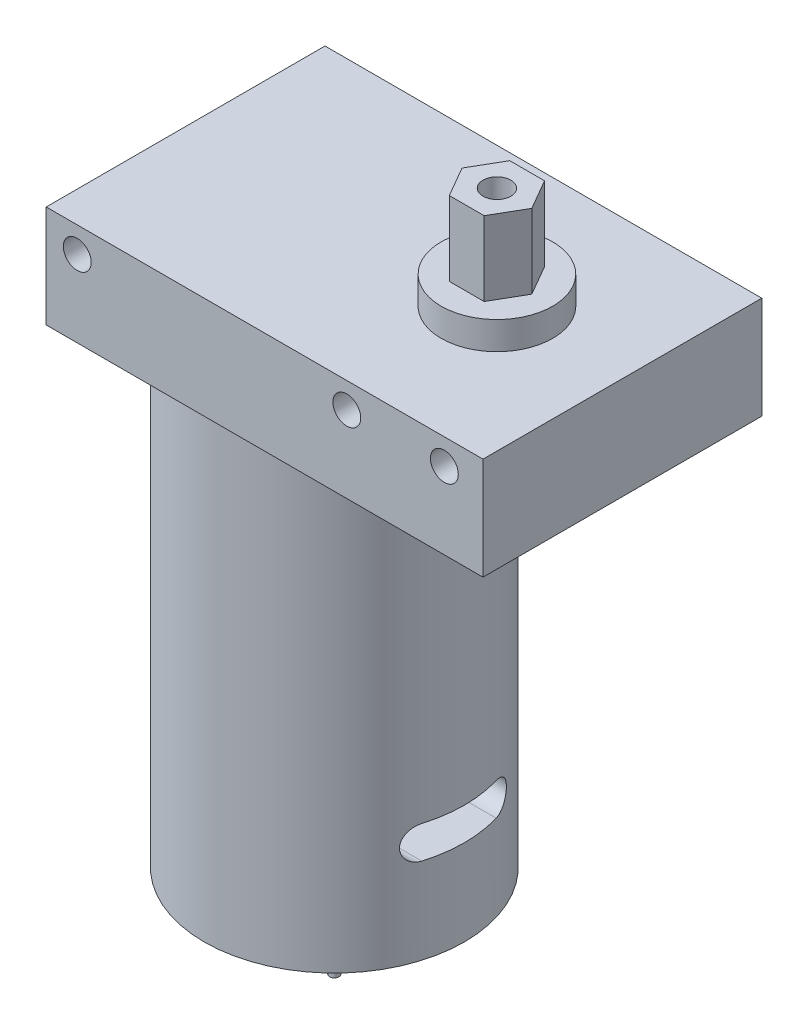
ISO-10303-21;
HEADER;
FILE_DESCRIPTION(('STEP AP214'),'2;1');
FILE_NAME('part.step','',(''),(''),'','','');
FILE_SCHEMA(('AUTOMOTIVE_DESIGN { 1 0 10303 214 1 1 1 1 }'));
ENDSEC;
DATA;
#1=APPLICATION_CONTEXT('core data for automotive mechanical design processes');
#2=APPLICATION_PROTOCOL_DEFINITION('international standard','automotive_design',2000,#1);
#3=PRODUCT_CONTEXT('',#1,'mechanical');
#4=PRODUCT('Part','Part','',(#3));
#5=PRODUCT_RELATED_PRODUCT_CATEGORY('part','',(#4));
#6=PRODUCT_DEFINITION_FORMATION('','',#4);
#7=PRODUCT_DEFINITION_CONTEXT('part definition',#1,'design');
#8=PRODUCT_DEFINITION('design','',#6,#7);
#9=PRODUCT_DEFINITION_SHAPE('','',#8);
#10=(LENGTH_UNIT() NAMED_UNIT(*) SI_UNIT(.MILLI.,.METRE.));
#11=(NAMED_UNIT(*) PLANE_ANGLE_UNIT() SI_UNIT($,.RADIAN.));
#12=(NAMED_UNIT(*) SI_UNIT($,.STERADIAN.) SOLID_ANGLE_UNIT());
#13=UNCERTAINTY_MEASURE_WITH_UNIT(LENGTH_MEASURE(1.E-05),#10,'distance_accuracy_value','');
#14=(GEOMETRIC_REPRESENTATION_CONTEXT(3) GLOBAL_UNCERTAINTY_ASSIGNED_CONTEXT((#13)) GLOBAL_UNIT_ASSIGNED_CONTEXT((#10,
#11,#12)) REPRESENTATION_CONTEXT('',''));
#15=CARTESIAN_POINT('',(0.,0.,0.));
#16=DIRECTION('',(0.,0.,1.));
#17=DIRECTION('',(1.,0.,0.));
#18=AXIS2_PLACEMENT_3D('',#15,#16,#17);
#19=CARTESIAN_POINT('',(16.,-52.,15.));
#20=DIRECTION('',(0.,-1.,0.));
#21=DIRECTION('',(0.,0.,-1.));
#22=AXIS2_PLACEMENT_3D('',#19,#20,#21);
#23=PLANE('',#22);
#24=CARTESIAN_POINT('',(16.,-52.,15.));
#25=DIRECTION('',(0.,-1.,0.));
#26=DIRECTION('',(0.,0.,-1.));
#27=AXIS2_PLACEMENT_3D('',#24,#25,#26);
#28=CIRCLE('',#27,5.);
#29=CARTESIAN_POINT('',(16.,-52.,10.));
#30=VERTEX_POINT('',#29);
#31=EDGE_CURVE('E252',#30,#30,#28,.T.);
#32=ORIENTED_EDGE('',*,*,#31,.T.);
#33=EDGE_LOOP('',(#32));
#34=FACE_BOUND('',#33,.T.);
#35=CARTESIAN_POINT('',(16.,-52.,15.));
#36=DIRECTION('',(0.,-1.,0.));
#37=DIRECTION('',(0.,0.,-1.));
#38=AXIS2_PLACEMENT_3D('',#35,#36,#37);
#39=CIRCLE('',#38,0.499999999999999);
#40=CARTESIAN_POINT('',(16.,-52.,14.5));
#41=VERTEX_POINT('',#40);
#42=EDGE_CURVE('E497',#41,#41,#39,.T.);
#43=ORIENTED_EDGE('',*,*,#42,.F.);
#44=EDGE_LOOP('',(#43));
#45=FACE_BOUND('',#44,.T.);
#46=ADVANCED_FACE('F42',(#34,#45),#23,.T.);
#47=CARTESIAN_POINT('',(16.,-50.,15.));
#48=DIRECTION('',(0.,-1.,0.));
#49=DIRECTION('',(0.,0.,-1.));
#50=AXIS2_PLACEMENT_3D('',#47,#48,#49);
#51=PLANE('',#50);
#52=CARTESIAN_POINT('',(16.,-50.,15.));
#53=DIRECTION('',(0.,-1.,0.));
#54=DIRECTION('',(0.,0.,-1.));
#55=AXIS2_PLACEMENT_3D('',#52,#53,#54);
#56=CIRCLE('',#55,14.);
#57=CARTESIAN_POINT('',(16.,-50.,0.999999999999999));
#58=VERTEX_POINT('',#57);
#59=EDGE_CURVE('E246',#58,#58,#56,.T.);
#60=ORIENTED_EDGE('',*,*,#59,.T.);
#61=EDGE_LOOP('',(#60));
#62=FACE_BOUND('',#61,.T.);
#63=CARTESIAN_POINT('',(16.,-50.,15.));
#64=DIRECTION('',(0.,-1.,0.));
#65=DIRECTION('',(0.,0.,-1.));
#66=AXIS2_PLACEMENT_3D('',#63,#64,#65);
#67=CIRCLE('',#66,5.);
#68=CARTESIAN_POINT('',(16.,-50.,10.));
#69=VERTEX_POINT('',#68);
#70=EDGE_CURVE('E249',#69,#69,#67,.T.);
#71=ORIENTED_EDGE('',*,*,#70,.F.);
#72=EDGE_LOOP('',(#71));
#73=FACE_BOUND('',#72,.T.);
#74=ADVANCED_FACE('F230',(#62,#73),#51,.T.);
#75=CARTESIAN_POINT('',(0.,0.,0.));
#76=DIRECTION('',(0.,1.,0.));
#77=DIRECTION('',(0.,0.,1.));
#78=AXIS2_PLACEMENT_3D('',#75,#76,#77);
#79=PLANE('',#78);
#80=DIRECTION('',(0.,0.,1.));
#81=VECTOR('',#80,1.);
#82=CARTESIAN_POINT('',(0.,0.,0.));
#83=LINE('',#82,#81);
#84=CARTESIAN_POINT('',(0.,0.,0.));
#85=VERTEX_POINT('',#84);
#86=CARTESIAN_POINT('',(0.,0.,30.));
#87=VERTEX_POINT('',#86);
#88=EDGE_CURVE('E332',#85,#87,#83,.T.);
#89=ORIENTED_EDGE('',*,*,#88,.F.);
#90=DIRECTION('',(-1.,0.,0.));
#91=VECTOR('',#90,1.);
#92=CARTESIAN_POINT('',(0.,0.,0.));
#93=LINE('',#92,#91);
#94=CARTESIAN_POINT('',(47.,0.,0.));
#95=VERTEX_POINT('',#94);
#96=EDGE_CURVE('E341',#95,#85,#93,.T.);
#97=ORIENTED_EDGE('',*,*,#96,.F.);
#98=DIRECTION('',(0.,0.,-1.));
#99=VECTOR('',#98,1.);
#100=CARTESIAN_POINT('',(47.,0.,0.));
#101=LINE('',#100,#99);
#102=CARTESIAN_POINT('',(47.,0.,30.));
#103=VERTEX_POINT('',#102);
#104=EDGE_CURVE('E357',#103,#95,#101,.T.);
#105=ORIENTED_EDGE('',*,*,#104,.F.);
#106=DIRECTION('',(1.,0.,0.));
#107=VECTOR('',#106,1.);
#108=CARTESIAN_POINT('',(0.,0.,30.));
#109=LINE('',#108,#107);
#110=EDGE_CURVE('E354',#87,#103,#109,.T.);
#111=ORIENTED_EDGE('',*,*,#110,.F.);
#112=EDGE_LOOP('',(#89,#97,#105,#111));
#113=FACE_BOUND('',#112,.T.);
#114=CARTESIAN_POINT('',(16.,0.,15.));
#115=DIRECTION('',(0.,1.,0.));
#116=DIRECTION('',(0.,0.,1.));
#117=AXIS2_PLACEMENT_3D('',#114,#115,#116);
#118=CIRCLE('',#117,14.);
#119=CARTESIAN_POINT('',(16.,0.,29.));
#120=VERTEX_POINT('',#119);
#121=EDGE_CURVE('E184',#120,#120,#118,.F.);
#122=ORIENTED_EDGE('',*,*,#121,.F.);
#123=EDGE_LOOP('',(#122));
#124=FACE_BOUND('',#123,.T.);
#125=ADVANCED_FACE('F235',(#113,#124),#79,.F.);
#126=CARTESIAN_POINT('',(33.5,14.,15.));
#127=DIRECTION('',(0.,1.,0.));
#128=DIRECTION('',(0.,0.,1.));
#129=AXIS2_PLACEMENT_3D('',#126,#127,#128);
#130=PLANE('',#129);
#131=CARTESIAN_POINT('',(33.5,14.,15.));
#132=DIRECTION('',(0.,1.,0.));
#133=DIRECTION('',(0.,0.,1.));
#134=AXIS2_PLACEMENT_3D('',#131,#132,#133);
#135=CIRCLE('',#134,5.99999999999999);
#136=CARTESIAN_POINT('',(33.5,14.,21.));
#137=VERTEX_POINT('',#136);
#138=EDGE_CURVE('E328',#137,#137,#135,.T.);
#139=ORIENTED_EDGE('',*,*,#138,.T.);
#140=EDGE_LOOP('',(#139));
#141=FACE_BOUND('',#140,.T.);
#142=DIRECTION('',(-0.5,0.,-0.866025403784438));
#143=VECTOR('',#142,1.);
#144=CARTESIAN_POINT('',(37.2527767497326,14.,15.));
#145=LINE('',#144,#143);
#146=CARTESIAN_POINT('',(37.2527767497326,14.,15.));
#147=VERTEX_POINT('',#146);
#148=CARTESIAN_POINT('',(35.3763883748663,14.,11.75));
#149=VERTEX_POINT('',#148);
#150=EDGE_CURVE('E291',#147,#149,#145,.T.);
#151=ORIENTED_EDGE('',*,*,#150,.F.);
#152=DIRECTION('',(0.5,0.,-0.866025403784439));
#153=VECTOR('',#152,1.);
#154=CARTESIAN_POINT('',(35.3763883748663,14.,18.25));
#155=LINE('',#154,#153);
#156=CARTESIAN_POINT('',(35.3763883748663,14.,18.25));
#157=VERTEX_POINT('',#156);
#158=EDGE_CURVE('E266',#157,#147,#155,.T.);
#159=ORIENTED_EDGE('',*,*,#158,.F.);
#160=DIRECTION('',(1.,0.,0.));
#161=VECTOR('',#160,1.);
#162=CARTESIAN_POINT('',(31.6236116251337,14.,18.25));
#163=LINE('',#162,#161);
#164=CARTESIAN_POINT('',(31.6236116251337,14.,18.25));
#165=VERTEX_POINT('',#164);
#166=EDGE_CURVE('E272',#165,#157,#163,.T.);
#167=ORIENTED_EDGE('',*,*,#166,.F.);
#168=DIRECTION('',(0.5,0.,0.866025403784438));
#169=VECTOR('',#168,1.);
#170=CARTESIAN_POINT('',(29.7472232502674,14.,15.));
#171=LINE('',#170,#169);
#172=CARTESIAN_POINT('',(29.7472232502674,14.,15.));
#173=VERTEX_POINT('',#172);
#174=EDGE_CURVE('E300',#173,#165,#171,.T.);
#175=ORIENTED_EDGE('',*,*,#174,.F.);
#176=DIRECTION('',(-0.5,0.,0.866025403784439));
#177=VECTOR('',#176,1.);
#178=CARTESIAN_POINT('',(31.6236116251337,14.,11.75));
#179=LINE('',#178,#177);
#180=CARTESIAN_POINT('',(31.6236116251337,14.,11.75));
#181=VERTEX_POINT('',#180);
#182=EDGE_CURVE('E297',#181,#173,#179,.T.);
#183=ORIENTED_EDGE('',*,*,#182,.F.);
#184=DIRECTION('',(-1.,0.,0.));
#185=VECTOR('',#184,1.);
#186=CARTESIAN_POINT('',(35.3763883748663,14.,11.75));
#187=LINE('',#186,#185);
#188=EDGE_CURVE('E294',#149,#181,#187,.T.);
#189=ORIENTED_EDGE('',*,*,#188,.F.);
#190=EDGE_LOOP('',(#151,#159,#167,#175,#183,#189));
#191=FACE_BOUND('',#190,.T.);
#192=ADVANCED_FACE('F240',(#141,#191),#130,.T.);
#193=CARTESIAN_POINT('',(0.,11.,0.));
#194=DIRECTION('',(0.,1.,0.));
#195=DIRECTION('',(0.,0.,1.));
#196=AXIS2_PLACEMENT_3D('',#193,#194,#195);
#197=PLANE('',#196);
#198=DIRECTION('',(0.,0.,1.));
#199=VECTOR('',#198,1.);
#200=CARTESIAN_POINT('',(0.,11.,0.));
#201=LINE('',#200,#199);
#202=CARTESIAN_POINT('',(0.,11.,0.));
#203=VERTEX_POINT('',#202);
#204=CARTESIAN_POINT('',(0.,11.,30.));
#205=VERTEX_POINT('',#204);
#206=EDGE_CURVE('E336',#203,#205,#201,.T.);
#207=ORIENTED_EDGE('',*,*,#206,.T.);
#208=DIRECTION('',(1.,0.,0.));
#209=VECTOR('',#208,1.);
#210=CARTESIAN_POINT('',(0.,11.,30.));
#211=LINE('',#210,#209);
#212=CARTESIAN_POINT('',(47.,11.,30.));
#213=VERTEX_POINT('',#212);
#214=EDGE_CURVE('E340',#205,#213,#211,.T.);
#215=ORIENTED_EDGE('',*,*,#214,.T.);
#216=DIRECTION('',(0.,0.,-1.));
#217=VECTOR('',#216,1.);
#218=CARTESIAN_POINT('',(47.,11.,0.));
#219=LINE('',#218,#217);
#220=CARTESIAN_POINT('',(47.,11.,0.));
#221=VERTEX_POINT('',#220);
#222=EDGE_CURVE('E344',#213,#221,#219,.T.);
#223=ORIENTED_EDGE('',*,*,#222,.T.);
#224=DIRECTION('',(-1.,0.,0.));
#225=VECTOR('',#224,1.);
#226=CARTESIAN_POINT('',(0.,11.,0.));
#227=LINE('',#226,#225);
#228=EDGE_CURVE('E347',#221,#203,#227,.T.);
#229=ORIENTED_EDGE('',*,*,#228,.T.);
#230=EDGE_LOOP('',(#207,#215,#223,#229));
#231=FACE_BOUND('',#230,.T.);
#232=CARTESIAN_POINT('',(33.5,11.,15.));
#233=DIRECTION('',(0.,1.,0.));
#234=DIRECTION('',(0.,0.,1.));
#235=AXIS2_PLACEMENT_3D('',#232,#233,#234);
#236=CIRCLE('',#235,5.99999999999999);
#237=CARTESIAN_POINT('',(33.5,11.,21.));
#238=VERTEX_POINT('',#237);
#239=EDGE_CURVE('E327',#238,#238,#236,.T.);
#240=ORIENTED_EDGE('',*,*,#239,.F.);
#241=EDGE_LOOP('',(#240));
#242=FACE_BOUND('',#241,.T.);
#243=ADVANCED_FACE('F419',(#231,#242),#197,.T.);
#244=CARTESIAN_POINT('',(0.,11.,0.));
#245=DIRECTION('',(1.,0.,0.));
#246=DIRECTION('',(0.,0.,-1.));
#247=AXIS2_PLACEMENT_3D('',#244,#245,#246);
#248=PLANE('',#247);
#249=ORIENTED_EDGE('',*,*,#88,.T.);
#250=DIRECTION('',(0.,-1.,0.));
#251=VECTOR('',#250,1.);
#252=CARTESIAN_POINT('',(0.,11.,30.));
#253=LINE('',#252,#251);
#254=EDGE_CURVE('E373',#205,#87,#253,.T.);
#255=ORIENTED_EDGE('',*,*,#254,.F.);
#256=ORIENTED_EDGE('',*,*,#206,.F.);
#257=DIRECTION('',(0.,-1.,0.));
#258=VECTOR('',#257,1.);
#259=CARTESIAN_POINT('',(0.,11.,0.));
#260=LINE('',#259,#258);
#261=EDGE_CURVE('E350',#203,#85,#260,.T.);
#262=ORIENTED_EDGE('',*,*,#261,.T.);
#263=EDGE_LOOP('',(#249,#255,#256,#262));
#264=FACE_BOUND('',#263,.T.);
#265=ADVANCED_FACE('F44',(#264),#248,.F.);
#266=CARTESIAN_POINT('',(0.,11.,30.));
#267=DIRECTION('',(0.,0.,-1.));
#268=DIRECTION('',(-1.,0.,0.));
#269=AXIS2_PLACEMENT_3D('',#266,#267,#268);
#270=PLANE('',#269);
#271=CARTESIAN_POINT('',(42.8407573826274,8.25,30.));
#272=DIRECTION('',(0.,0.,1.));
#273=DIRECTION('',(1.,0.,0.));
#274=AXIS2_PLACEMENT_3D('',#271,#272,#273);
#275=CIRCLE('',#274,1.5);
#276=CARTESIAN_POINT('',(44.3407573826274,8.25,30.));
#277=VERTEX_POINT('',#276);
#278=EDGE_CURVE('E444',#277,#277,#275,.T.);
#279=ORIENTED_EDGE('',*,*,#278,.F.);
#280=EDGE_LOOP('',(#279));
#281=FACE_BOUND('',#280,.T.);
#282=CARTESIAN_POINT('',(32.3407573826274,8.25,30.));
#283=DIRECTION('',(0.,0.,1.));
#284=DIRECTION('',(1.,0.,0.));
#285=AXIS2_PLACEMENT_3D('',#282,#283,#284);
#286=CIRCLE('',#285,1.5);
#287=CARTESIAN_POINT('',(33.8407573826274,8.25,30.));
#288=VERTEX_POINT('',#287);
#289=EDGE_CURVE('E448',#288,#288,#286,.T.);
#290=ORIENTED_EDGE('',*,*,#289,.F.);
#291=EDGE_LOOP('',(#290));
#292=FACE_BOUND('',#291,.T.);
#293=CARTESIAN_POINT('',(3.34075738262738,8.25,30.));
#294=DIRECTION('',(0.,0.,1.));
#295=DIRECTION('',(1.,0.,0.));
#296=AXIS2_PLACEMENT_3D('',#293,#294,#295);
#297=CIRCLE('',#296,1.5);
#298=CARTESIAN_POINT('',(4.84075738262738,8.25,30.));
#299=VERTEX_POINT('',#298);
#300=EDGE_CURVE('E260',#299,#299,#297,.T.);
#301=ORIENTED_EDGE('',*,*,#300,.F.);
#302=EDGE_LOOP('',(#301));
#303=FACE_BOUND('',#302,.T.);
#304=ORIENTED_EDGE('',*,*,#110,.T.);
#305=DIRECTION('',(0.,-1.,0.));
#306=VECTOR('',#305,1.);
#307=CARTESIAN_POINT('',(47.,11.,30.));
#308=LINE('',#307,#306);
#309=EDGE_CURVE('E369',#213,#103,#308,.T.);
#310=ORIENTED_EDGE('',*,*,#309,.F.);
#311=ORIENTED_EDGE('',*,*,#214,.F.);
#312=ORIENTED_EDGE('',*,*,#254,.T.);
#313=EDGE_LOOP('',(#304,#310,#311,#312));
#314=FACE_BOUND('',#313,.T.);
#315=ADVANCED_FACE('F433',(#281,#292,#303,#314),#270,.F.);
#316=CARTESIAN_POINT('',(47.,11.,0.));
#317=DIRECTION('',(-1.,0.,0.));
#318=DIRECTION('',(0.,0.,1.));
#319=AXIS2_PLACEMENT_3D('',#316,#317,#318);
#320=PLANE('',#319);
#321=ORIENTED_EDGE('',*,*,#104,.T.);
#322=DIRECTION('',(0.,-1.,0.));
#323=VECTOR('',#322,1.);
#324=CARTESIAN_POINT('',(47.,11.,0.));
#325=LINE('',#324,#323);
#326=EDGE_CURVE('E365',#221,#95,#325,.T.);
#327=ORIENTED_EDGE('',*,*,#326,.F.);
#328=ORIENTED_EDGE('',*,*,#222,.F.);
#329=ORIENTED_EDGE('',*,*,#309,.T.);
#330=EDGE_LOOP('',(#321,#327,#328,#329));
#331=FACE_BOUND('',#330,.T.);
#332=ADVANCED_FACE('F430',(#331),#320,.F.);
#333=CARTESIAN_POINT('',(0.,11.,0.));
#334=DIRECTION('',(0.,0.,1.));
#335=DIRECTION('',(1.,0.,0.));
#336=AXIS2_PLACEMENT_3D('',#333,#334,#335);
#337=PLANE('',#336);
#338=CARTESIAN_POINT('',(42.8407573826274,8.25,0.));
#339=DIRECTION('',(0.,0.,1.));
#340=DIRECTION('',(1.,0.,0.));
#341=AXIS2_PLACEMENT_3D('',#338,#339,#340);
#342=CIRCLE('',#341,1.5);
#343=CARTESIAN_POINT('',(44.3407573826274,8.25,0.));
#344=VERTEX_POINT('',#343);
#345=EDGE_CURVE('E474',#344,#344,#342,.T.);
#346=ORIENTED_EDGE('',*,*,#345,.T.);
#347=EDGE_LOOP('',(#346));
#348=FACE_BOUND('',#347,.T.);
#349=CARTESIAN_POINT('',(32.3407573826274,8.25,0.));
#350=DIRECTION('',(0.,0.,1.));
#351=DIRECTION('',(1.,0.,0.));
#352=AXIS2_PLACEMENT_3D('',#349,#350,#351);
#353=CIRCLE('',#352,1.5);
#354=CARTESIAN_POINT('',(33.8407573826274,8.25,0.));
#355=VERTEX_POINT('',#354);
#356=EDGE_CURVE('E468',#355,#355,#353,.T.);
#357=ORIENTED_EDGE('',*,*,#356,.T.);
#358=EDGE_LOOP('',(#357));
#359=FACE_BOUND('',#358,.T.);
#360=CARTESIAN_POINT('',(3.34075738262738,8.25,0.));
#361=DIRECTION('',(0.,0.,1.));
#362=DIRECTION('',(1.,0.,0.));
#363=AXIS2_PLACEMENT_3D('',#360,#361,#362);
#364=CIRCLE('',#363,1.5);
#365=CARTESIAN_POINT('',(4.84075738262738,8.25,0.));
#366=VERTEX_POINT('',#365);
#367=EDGE_CURVE('E253',#366,#366,#364,.T.);
#368=ORIENTED_EDGE('',*,*,#367,.T.);
#369=EDGE_LOOP('',(#368));
#370=FACE_BOUND('',#369,.T.);
#371=ORIENTED_EDGE('',*,*,#96,.T.);
#372=ORIENTED_EDGE('',*,*,#261,.F.);
#373=ORIENTED_EDGE('',*,*,#228,.F.);
#374=ORIENTED_EDGE('',*,*,#326,.T.);
#375=EDGE_LOOP('',(#371,#372,#373,#374));
#376=FACE_BOUND('',#375,.T.);
#377=ADVANCED_FACE('F423',(#348,#359,#370,#376),#337,.F.);
#378=CARTESIAN_POINT('',(33.5,14.,15.));
#379=DIRECTION('',(0.,-1.,0.));
#380=DIRECTION('',(0.,0.,-1.));
#381=AXIS2_PLACEMENT_3D('',#378,#379,#380);
#382=CYLINDRICAL_SURFACE('',#381,5.99999999999999);
#383=ORIENTED_EDGE('',*,*,#138,.F.);
#384=EDGE_LOOP('',(#383));
#385=FACE_BOUND('',#384,.T.);
#386=ORIENTED_EDGE('',*,*,#239,.T.);
#387=EDGE_LOOP('',(#386));
#388=FACE_BOUND('',#387,.T.);
#389=ADVANCED_FACE('F415',(#385,#388),#382,.T.);
#390=CARTESIAN_POINT('',(35.3763883748663,22.,18.25));
#391=DIRECTION('',(-0.866025403784439,0.,-0.5));
#392=DIRECTION('',(-0.5,0.,0.866025403784439));
#393=AXIS2_PLACEMENT_3D('',#390,#391,#392);
#394=PLANE('',#393);
#395=ORIENTED_EDGE('',*,*,#158,.T.);
#396=DIRECTION('',(0.,-1.,0.));
#397=VECTOR('',#396,1.);
#398=CARTESIAN_POINT('',(37.2527767497326,22.,15.));
#399=LINE('',#398,#397);
#400=CARTESIAN_POINT('',(37.2527767497326,22.,15.));
#401=VERTEX_POINT('',#400);
#402=EDGE_CURVE('E324',#401,#147,#399,.T.);
#403=ORIENTED_EDGE('',*,*,#402,.F.);
#404=DIRECTION('',(0.5,0.,-0.866025403784439));
#405=VECTOR('',#404,1.);
#406=CARTESIAN_POINT('',(35.3763883748663,22.,18.25));
#407=LINE('',#406,#405);
#408=CARTESIAN_POINT('',(35.3763883748663,22.,18.25));
#409=VERTEX_POINT('',#408);
#410=EDGE_CURVE('E267',#409,#401,#407,.T.);
#411=ORIENTED_EDGE('',*,*,#410,.F.);
#412=DIRECTION('',(0.,-1.,0.));
#413=VECTOR('',#412,1.);
#414=CARTESIAN_POINT('',(35.3763883748663,22.,18.25));
#415=LINE('',#414,#413);
#416=EDGE_CURVE('E287',#409,#157,#415,.T.);
#417=ORIENTED_EDGE('',*,*,#416,.T.);
#418=EDGE_LOOP('',(#395,#403,#411,#417));
#419=FACE_BOUND('',#418,.T.);
#420=ADVANCED_FACE('F411',(#419),#394,.F.);
#421=CARTESIAN_POINT('',(37.2527767497326,22.,15.));
#422=DIRECTION('',(-0.866025403784438,0.,0.5));
#423=DIRECTION('',(0.5,0.,0.866025403784439));
#424=AXIS2_PLACEMENT_3D('',#421,#422,#423);
#425=PLANE('',#424);
#426=ORIENTED_EDGE('',*,*,#150,.T.);
#427=DIRECTION('',(0.,-1.,0.));
#428=VECTOR('',#427,1.);
#429=CARTESIAN_POINT('',(35.3763883748663,22.,11.75));
#430=LINE('',#429,#428);
#431=CARTESIAN_POINT('',(35.3763883748663,22.,11.75));
#432=VERTEX_POINT('',#431);
#433=EDGE_CURVE('E320',#432,#149,#430,.T.);
#434=ORIENTED_EDGE('',*,*,#433,.F.);
#435=DIRECTION('',(-0.5,0.,-0.866025403784438));
#436=VECTOR('',#435,1.);
#437=CARTESIAN_POINT('',(37.2527767497326,22.,15.));
#438=LINE('',#437,#436);
#439=EDGE_CURVE('E271',#401,#432,#438,.T.);
#440=ORIENTED_EDGE('',*,*,#439,.F.);
#441=ORIENTED_EDGE('',*,*,#402,.T.);
#442=EDGE_LOOP('',(#426,#434,#440,#441));
#443=FACE_BOUND('',#442,.T.);
#444=ADVANCED_FACE('F407',(#443),#425,.F.);
#445=CARTESIAN_POINT('',(35.3763883748663,22.,11.75));
#446=DIRECTION('',(0.,0.,1.));
#447=DIRECTION('',(1.,0.,0.));
#448=AXIS2_PLACEMENT_3D('',#445,#446,#447);
#449=PLANE('',#448);
#450=ORIENTED_EDGE('',*,*,#188,.T.);
#451=DIRECTION('',(0.,-1.,0.));
#452=VECTOR('',#451,1.);
#453=CARTESIAN_POINT('',(31.6236116251337,22.,11.75));
#454=LINE('',#453,#452);
#455=CARTESIAN_POINT('',(31.6236116251337,22.,11.75));
#456=VERTEX_POINT('',#455);
#457=EDGE_CURVE('E316',#456,#181,#454,.T.);
#458=ORIENTED_EDGE('',*,*,#457,.F.);
#459=DIRECTION('',(-1.,0.,0.));
#460=VECTOR('',#459,1.);
#461=CARTESIAN_POINT('',(35.3763883748663,22.,11.75));
#462=LINE('',#461,#460);
#463=EDGE_CURVE('E275',#432,#456,#462,.T.);
#464=ORIENTED_EDGE('',*,*,#463,.F.);
#465=ORIENTED_EDGE('',*,*,#433,.T.);
#466=EDGE_LOOP('',(#450,#458,#464,#465));
#467=FACE_BOUND('',#466,.T.);
#468=ADVANCED_FACE('F403',(#467),#449,.F.);
#469=CARTESIAN_POINT('',(31.6236116251337,22.,11.75));
#470=DIRECTION('',(0.866025403784439,0.,0.5));
#471=DIRECTION('',(0.5,0.,-0.866025403784439));
#472=AXIS2_PLACEMENT_3D('',#469,#470,#471);
#473=PLANE('',#472);
#474=ORIENTED_EDGE('',*,*,#182,.T.);
#475=DIRECTION('',(0.,-1.,0.));
#476=VECTOR('',#475,1.);
#477=CARTESIAN_POINT('',(29.7472232502674,22.,15.));
#478=LINE('',#477,#476);
#479=CARTESIAN_POINT('',(29.7472232502674,22.,15.));
#480=VERTEX_POINT('',#479);
#481=EDGE_CURVE('E312',#480,#173,#478,.T.);
#482=ORIENTED_EDGE('',*,*,#481,.F.);
#483=DIRECTION('',(-0.5,0.,0.866025403784439));
#484=VECTOR('',#483,1.);
#485=CARTESIAN_POINT('',(31.6236116251337,22.,11.75));
#486=LINE('',#485,#484);
#487=EDGE_CURVE('E278',#456,#480,#486,.T.);
#488=ORIENTED_EDGE('',*,*,#487,.F.);
#489=ORIENTED_EDGE('',*,*,#457,.T.);
#490=EDGE_LOOP('',(#474,#482,#488,#489));
#491=FACE_BOUND('',#490,.T.);
#492=ADVANCED_FACE('F399',(#491),#473,.F.);
#493=CARTESIAN_POINT('',(29.7472232502674,22.,15.));
#494=DIRECTION('',(0.866025403784438,0.,-0.5));
#495=DIRECTION('',(-0.5,0.,-0.866025403784439));
#496=AXIS2_PLACEMENT_3D('',#493,#494,#495);
#497=PLANE('',#496);
#498=ORIENTED_EDGE('',*,*,#174,.T.);
#499=DIRECTION('',(0.,-1.,0.));
#500=VECTOR('',#499,1.);
#501=CARTESIAN_POINT('',(31.6236116251337,22.,18.25));
#502=LINE('',#501,#500);
#503=CARTESIAN_POINT('',(31.6236116251337,22.,18.25));
#504=VERTEX_POINT('',#503);
#505=EDGE_CURVE('E309',#504,#165,#502,.T.);
#506=ORIENTED_EDGE('',*,*,#505,.F.);
#507=DIRECTION('',(0.5,0.,0.866025403784438));
#508=VECTOR('',#507,1.);
#509=CARTESIAN_POINT('',(29.7472232502674,22.,15.));
#510=LINE('',#509,#508);
#511=EDGE_CURVE('E281',#480,#504,#510,.T.);
#512=ORIENTED_EDGE('',*,*,#511,.F.);
#513=ORIENTED_EDGE('',*,*,#481,.T.);
#514=EDGE_LOOP('',(#498,#506,#512,#513));
#515=FACE_BOUND('',#514,.T.);
#516=ADVANCED_FACE('F391',(#515),#497,.F.);
#517=CARTESIAN_POINT('',(31.6236116251337,22.,18.25));
#518=DIRECTION('',(0.,0.,-1.));
#519=DIRECTION('',(-1.,0.,0.));
#520=AXIS2_PLACEMENT_3D('',#517,#518,#519);
#521=PLANE('',#520);
#522=ORIENTED_EDGE('',*,*,#166,.T.);
#523=ORIENTED_EDGE('',*,*,#416,.F.);
#524=DIRECTION('',(1.,0.,0.));
#525=VECTOR('',#524,1.);
#526=CARTESIAN_POINT('',(31.6236116251337,22.,18.25));
#527=LINE('',#526,#525);
#528=EDGE_CURVE('E284',#504,#409,#527,.T.);
#529=ORIENTED_EDGE('',*,*,#528,.F.);
#530=ORIENTED_EDGE('',*,*,#505,.T.);
#531=EDGE_LOOP('',(#522,#523,#529,#530));
#532=FACE_BOUND('',#531,.T.);
#533=ADVANCED_FACE('F386',(#532),#521,.F.);
#534=CARTESIAN_POINT('',(0.,22.,0.));
#535=DIRECTION('',(0.,1.,0.));
#536=DIRECTION('',(0.,0.,1.));
#537=AXIS2_PLACEMENT_3D('',#534,#535,#536);
#538=PLANE('',#537);
#539=CARTESIAN_POINT('',(33.5,22.,15.));
#540=DIRECTION('',(0.,1.,0.));
#541=DIRECTION('',(0.,0.,1.));
#542=AXIS2_PLACEMENT_3D('',#539,#540,#541);
#543=CIRCLE('',#542,1.5);
#544=CARTESIAN_POINT('',(33.5,22.,16.5));
#545=VERTEX_POINT('',#544);
#546=EDGE_CURVE('E489',#545,#545,#543,.T.);
#547=ORIENTED_EDGE('',*,*,#546,.F.);
#548=EDGE_LOOP('',(#547));
#549=FACE_BOUND('',#548,.T.);
#550=ORIENTED_EDGE('',*,*,#410,.T.);
#551=ORIENTED_EDGE('',*,*,#439,.T.);
#552=ORIENTED_EDGE('',*,*,#463,.T.);
#553=ORIENTED_EDGE('',*,*,#487,.T.);
#554=ORIENTED_EDGE('',*,*,#511,.T.);
#555=ORIENTED_EDGE('',*,*,#528,.T.);
#556=EDGE_LOOP('',(#550,#551,#552,#553,#554,#555));
#557=FACE_BOUND('',#556,.T.);
#558=ADVANCED_FACE('F382',(#549,#557),#538,.T.);
#559=CARTESIAN_POINT('',(16.,-50.,15.));
#560=DIRECTION('',(0.,1.,0.));
#561=DIRECTION('',(0.,0.,1.));
#562=AXIS2_PLACEMENT_3D('',#559,#560,#561);
#563=CYLINDRICAL_SURFACE('',#562,14.);
#564=CARTESIAN_POINT('',(16.,-37.25,15.));
#565=DIRECTION('',(0.,1.,0.));
#566=DIRECTION('',(0.,0.,1.));
#567=AXIS2_PLACEMENT_3D('',#564,#565,#566);
#568=CIRCLE('',#567,14.);
#569=CARTESIAN_POINT('',(29.4164078649987,-37.25,19.));
#570=VERTEX_POINT('',#569);
#571=CARTESIAN_POINT('',(29.4164078649987,-37.25,11.));
#572=VERTEX_POINT('',#571);
#573=EDGE_CURVE('E57',#570,#572,#568,.T.);
#574=ORIENTED_EDGE('',*,*,#573,.T.);
#575=CARTESIAN_POINT('',(29.4164078649987,-37.25,11.));
#576=CARTESIAN_POINT('',(29.4009505736263,-37.2500013571118,10.9481484949685));
#577=CARTESIAN_POINT('',(29.3851973115395,-37.2523055307532,10.8964157711557));
#578=CARTESIAN_POINT('',(29.3532147991357,-37.2614565880063,10.793510955877));
#579=CARTESIAN_POINT('',(29.3369856267093,-37.2683027321719,10.7423387745314));
#580=CARTESIAN_POINT('',(29.2877938697727,-37.2955368395137,10.5902565545779));
#581=CARTESIAN_POINT('',(29.2542855074683,-37.3226208280629,10.4906418556386));
#582=CARTESIAN_POINT('',(29.1871085445877,-37.3937618037879,10.2978066692511));
#583=CARTESIAN_POINT('',(29.1534399584964,-37.4378172844213,10.2045856151103));
#584=CARTESIAN_POINT('',(29.0873160978216,-37.5418242311756,10.0269589491946));
#585=CARTESIAN_POINT('',(29.0548608734129,-37.6017763538264,9.94255370171244));
#586=CARTESIAN_POINT('',(28.9927082129094,-37.7363129722698,9.78495172650631));
#587=CARTESIAN_POINT('',(28.9630137347517,-37.8109129018539,9.71176696745845));
#588=CARTESIAN_POINT('',(28.9081408210273,-37.9729763720471,9.57920123949276));
#589=CARTESIAN_POINT('',(28.8829612012622,-38.0604365285721,9.5198166497269));
#590=CARTESIAN_POINT('',(28.8400678609597,-38.2407905983935,9.42008464083569));
#591=CARTESIAN_POINT('',(28.8220214668572,-38.3331267782414,9.37887456115723));
#592=CARTESIAN_POINT('',(28.792856208973,-38.5244914044475,9.31280807060966));
#593=CARTESIAN_POINT('',(28.7817324365737,-38.6235150535723,9.28794007137376));
#594=CARTESIAN_POINT('',(28.7679141926918,-38.8165861443776,9.25712389021523));
#595=CARTESIAN_POINT('',(28.7645989858497,-38.910368367026,9.24978176852281));
#596=CARTESIAN_POINT('',(28.7648002145439,-39.0978786214009,9.25022794714364));
#597=CARTESIAN_POINT('',(28.7683149487971,-39.1916066608068,9.25801247952979));
#598=CARTESIAN_POINT('',(28.7816324505206,-39.3723670827669,9.28772240836042));
#599=CARTESIAN_POINT('',(28.7911738742804,-39.4595167756579,9.30906027865145));
#600=CARTESIAN_POINT('',(28.8156789258599,-39.6288527787751,9.36446234825145));
#601=CARTESIAN_POINT('',(28.8306432082558,-39.7110384884169,9.39852808391608));
#602=CARTESIAN_POINT('',(28.8657072862595,-39.8712045293316,9.47953086272761));
#603=CARTESIAN_POINT('',(28.8859627732998,-39.9489506995042,9.52686200562511));
#604=CARTESIAN_POINT('',(28.9302506270026,-40.0955071563769,9.63232964481147));
#605=CARTESIAN_POINT('',(28.9542839804562,-40.1643150997823,9.69046896495843));
#606=CARTESIAN_POINT('',(29.0069786357766,-40.2966622870333,9.82082906794614));
#607=CARTESIAN_POINT('',(29.0358537895784,-40.359387987224,9.89378938030897));
#608=CARTESIAN_POINT('',(29.0954064187095,-40.4718465493623,10.0485150622465));
#609=CARTESIAN_POINT('',(29.1260851400704,-40.5215702963118,10.1302865524754));
#610=CARTESIAN_POINT('',(29.1901069809206,-40.6098689206112,10.3063422686669));
#611=CARTESIAN_POINT('',(29.22349102076,-40.6474751239935,10.4010976432122));
#612=CARTESIAN_POINT('',(29.2896065183108,-40.7057035538527,10.595810720767));
#613=CARTESIAN_POINT('',(29.3223388898936,-40.7263514808374,10.695760306509));
#614=CARTESIAN_POINT('',(29.3647670860905,-40.7421087531431,10.8305561176962));
#615=CARTESIAN_POINT('',(29.3752648014799,-40.7450661787456,10.8643557979106));
#616=CARTESIAN_POINT('',(29.3960189922165,-40.7490093996228,10.9320861901119));
#617=CARTESIAN_POINT('',(29.4062758160628,-40.7499982419191,10.9660166180242));
#618=CARTESIAN_POINT('',(29.4164078649987,-40.75,11.));
#619=B_SPLINE_CURVE_WITH_KNOTS('',3,(#575,#576,#577,#578,#579,#580,#581,#582,#583,#584,#585,
#586,#587,#588,#589,#590,#591,#592,#593,#594,#595,#596,#597,#598,#599,#600,#601,#602,#603,#604,
#605,#606,#607,#608,#609,#610,#611,#612,#613,#614,#615,#616,#617,#618),.UNSPECIFIED.,.F.,.F.,(4,
2,2,2,2,2,2,2,2,2,2,2,2,2,2,2,2,2,2,2,2,4),(0.,0.162213269936145,0.324400137557104,
0.648344274287916,0.972259661442537,1.29618842835805,1.62046035516602,1.94464710415035,
2.25112638604724,2.55738810459366,2.83833541570881,3.11921275409341,3.38867553347052,
3.65817084968474,3.93672331399788,4.21534865840365,4.51542624864582,4.81571364717901,
5.13609483521936,5.45598958039699,5.56249570636635,5.66883685095987),.UNSPECIFIED.);
#620=CARTESIAN_POINT('',(29.4164078649987,-40.75,11.));
#621=VERTEX_POINT('',#620);
#622=EDGE_CURVE('E11',#572,#621,#619,.T.);
#623=ORIENTED_EDGE('',*,*,#622,.T.);
#624=CARTESIAN_POINT('',(16.,-40.75,15.));
#625=DIRECTION('',(0.,-1.,0.));
#626=DIRECTION('',(0.,0.,-1.));
#627=AXIS2_PLACEMENT_3D('',#624,#625,#626);
#628=CIRCLE('',#627,14.);
#629=CARTESIAN_POINT('',(29.4164078649987,-40.75,19.));
#630=VERTEX_POINT('',#629);
#631=EDGE_CURVE('E147',#621,#630,#628,.T.);
#632=ORIENTED_EDGE('',*,*,#631,.T.);
#633=CARTESIAN_POINT('',(29.4164078649987,-40.75,19.));
#634=CARTESIAN_POINT('',(29.4009505736263,-40.7499986428882,19.0518515050315));
#635=CARTESIAN_POINT('',(29.3851973115395,-40.7476944692468,19.1035842288443));
#636=CARTESIAN_POINT('',(29.3532147991357,-40.7385434119937,19.206489044123));
#637=CARTESIAN_POINT('',(29.3369856267093,-40.7316972678281,19.2576612254686));
#638=CARTESIAN_POINT('',(29.2877938697727,-40.7044631604863,19.4097434454221));
#639=CARTESIAN_POINT('',(29.2542855074683,-40.6773791719372,19.5093581443614));
#640=CARTESIAN_POINT('',(29.1871085445877,-40.6062381962121,19.7021933307489));
#641=CARTESIAN_POINT('',(29.1534399584964,-40.5621827155787,19.7954143848897));
#642=CARTESIAN_POINT('',(29.0873160978216,-40.4581757688245,19.9730410508054));
#643=CARTESIAN_POINT('',(29.0548608734129,-40.3982236461737,20.0574462982876));
#644=CARTESIAN_POINT('',(28.9927082129094,-40.2636870277302,20.2150482734937));
#645=CARTESIAN_POINT('',(28.9630137347517,-40.1890870981461,20.2882330325415));
#646=CARTESIAN_POINT('',(28.9081408210273,-40.0270236279529,20.4207987605072));
#647=CARTESIAN_POINT('',(28.8829612012622,-39.9395634714279,20.4801833502731));
#648=CARTESIAN_POINT('',(28.8400678609597,-39.7592094016065,20.5799153591643));
#649=CARTESIAN_POINT('',(28.8220214668572,-39.6668732217586,20.6211254388428));
#650=CARTESIAN_POINT('',(28.792856208973,-39.4755085955525,20.6871919293903));
#651=CARTESIAN_POINT('',(28.7817324365737,-39.3764849464277,20.7120599286262));
#652=CARTESIAN_POINT('',(28.7679141926918,-39.1834138556224,20.7428761097848));
#653=CARTESIAN_POINT('',(28.7645989858497,-39.089631632974,20.7502182314772));
#654=CARTESIAN_POINT('',(28.7648002145439,-38.9021213785991,20.7497720528564));
#655=CARTESIAN_POINT('',(28.7683149487971,-38.8083933391932,20.7419875204702));
#656=CARTESIAN_POINT('',(28.7816324505206,-38.6276329172332,20.7122775916396));
#657=CARTESIAN_POINT('',(28.7911738742804,-38.5404832243421,20.6909397213485));
#658=CARTESIAN_POINT('',(28.8156789258599,-38.3711472212249,20.6355376517485));
#659=CARTESIAN_POINT('',(28.8306432082558,-38.2889615115832,20.6014719160839));
#660=CARTESIAN_POINT('',(28.8657072862595,-38.1287954706684,20.5204691372724));
#661=CARTESIAN_POINT('',(28.8859627732998,-38.0510493004958,20.4731379943749));
#662=CARTESIAN_POINT('',(28.9302506270026,-37.9044928436232,20.3676703551885));
#663=CARTESIAN_POINT('',(28.9542839804562,-37.8356849002177,20.3095310350416));
#664=CARTESIAN_POINT('',(29.0069786357766,-37.7033377129667,20.1791709320538));
#665=CARTESIAN_POINT('',(29.0358537895785,-37.640612012776,20.106210619691));
#666=CARTESIAN_POINT('',(29.0954064187095,-37.5281534506377,19.9514849377535));
#667=CARTESIAN_POINT('',(29.1260851400704,-37.4784297036882,19.8697134475246));
#668=CARTESIAN_POINT('',(29.1901069809206,-37.3901310793888,19.6936577313331));
#669=CARTESIAN_POINT('',(29.22349102076,-37.3525248760065,19.5989023567878));
#670=CARTESIAN_POINT('',(29.2896065183108,-37.2942964461473,19.4041892792329));
#671=CARTESIAN_POINT('',(29.3223388898936,-37.2736485191626,19.304239693491));
#672=CARTESIAN_POINT('',(29.3647670860905,-37.2578912468569,19.1694438823038));
#673=CARTESIAN_POINT('',(29.3752648014799,-37.2549338212544,19.1356442020894));
#674=CARTESIAN_POINT('',(29.3960189922165,-37.2509906003772,19.0679138098881));
#675=CARTESIAN_POINT('',(29.4062758160628,-37.2500017580809,19.0339833819758));
#676=CARTESIAN_POINT('',(29.4164078649987,-37.25,19.));
#677=B_SPLINE_CURVE_WITH_KNOTS('',3,(#633,#634,#635,#636,#637,#638,#639,#640,#641,#642,#643,
#644,#645,#646,#647,#648,#649,#650,#651,#652,#653,#654,#655,#656,#657,#658,#659,#660,#661,#662,
#663,#664,#665,#666,#667,#668,#669,#670,#671,#672,#673,#674,#675,#676),.UNSPECIFIED.,.F.,.F.,(4,
2,2,2,2,2,2,2,2,2,2,2,2,2,2,2,2,2,2,2,2,4),(0.,0.162213269936145,0.324400137557107,
0.648344274287922,0.972259661442547,1.29618842835806,1.62046035516602,1.94464710415035,
2.25112638604724,2.55738810459367,2.83833541570882,3.11921275409342,3.38867553347051,
3.65817084968475,3.93672331399789,4.21534865840366,4.51542624864583,4.81571364717902,
5.13609483521937,5.455989580397,5.56249570636635,5.66883685095987),.UNSPECIFIED.);
#678=EDGE_CURVE('E152',#630,#570,#677,.T.);
#679=ORIENTED_EDGE('',*,*,#678,.T.);
#680=EDGE_LOOP('',(#574,#623,#632,#679));
#681=FACE_BOUND('',#680,.T.);
#682=CARTESIAN_POINT('',(2.58359213500126,-40.75,19.));
#683=VERTEX_POINT('',#682);
#684=CARTESIAN_POINT('',(2.58359213500126,-40.75,11.));
#685=VERTEX_POINT('',#684);
#686=EDGE_CURVE('E155',#683,#685,#628,.T.);
#687=ORIENTED_EDGE('',*,*,#686,.T.);
#688=CARTESIAN_POINT('',(2.58359213500126,-40.75,11.));
#689=CARTESIAN_POINT('',(2.59904942637373,-40.7499986428882,10.9481484949685));
#690=CARTESIAN_POINT('',(2.61480268846053,-40.7476944692468,10.8964157711557));
#691=CARTESIAN_POINT('',(2.6467852008643,-40.7385434119937,10.793510955877));
#692=CARTESIAN_POINT('',(2.66301437329067,-40.7316972678281,10.7423387745314));
#693=CARTESIAN_POINT('',(2.71220613022727,-40.7044631604863,10.5902565545779));
#694=CARTESIAN_POINT('',(2.74571449253172,-40.6773791719372,10.4906418556386));
#695=CARTESIAN_POINT('',(2.81289145541228,-40.6062381962121,10.2978066692511));
#696=CARTESIAN_POINT('',(2.84656004150355,-40.5621827155787,10.2045856151103));
#697=CARTESIAN_POINT('',(2.91268390217843,-40.4581757688245,10.0269589491946));
#698=CARTESIAN_POINT('',(2.94513912658714,-40.3982236461737,9.94255370171245));
#699=CARTESIAN_POINT('',(3.00729178709057,-40.2636870277302,9.78495172650631));
#700=CARTESIAN_POINT('',(3.03698626524831,-40.1890870981461,9.71176696745846));
#701=CARTESIAN_POINT('',(3.09185917897273,-40.0270236279529,9.57920123949277));
#702=CARTESIAN_POINT('',(3.11703879873781,-39.9395634714279,9.51981664972691));
#703=CARTESIAN_POINT('',(3.15993213904033,-39.7592094016065,9.42008464083569));
#704=CARTESIAN_POINT('',(3.17797853314276,-39.6668732217586,9.37887456115723));
#705=CARTESIAN_POINT('',(3.20714379102703,-39.4755085955525,9.31280807060967));
#706=CARTESIAN_POINT('',(3.21826756342633,-39.3764849464277,9.28794007137376));
#707=CARTESIAN_POINT('',(3.23208580730823,-39.1834138556224,9.25712389021523));
#708=CARTESIAN_POINT('',(3.23540101415032,-39.089631632974,9.24978176852281));
#709=CARTESIAN_POINT('',(3.23519978545613,-38.9021213785991,9.25022794714364));
#710=CARTESIAN_POINT('',(3.23168505120289,-38.8083933391932,9.25801247952979));
#711=CARTESIAN_POINT('',(3.21836754947936,-38.6276329172332,9.28772240836042));
#712=CARTESIAN_POINT('',(3.20882612571964,-38.5404832243421,9.30906027865145));
#713=CARTESIAN_POINT('',(3.18432107414011,-38.3711472212249,9.36446234825146));
#714=CARTESIAN_POINT('',(3.16935679174424,-38.2889615115832,9.39852808391609));
#715=CARTESIAN_POINT('',(3.13429271374046,-38.1287954706684,9.47953086272761));
#716=CARTESIAN_POINT('',(3.1140372267002,-38.0510493004958,9.52686200562511));
#717=CARTESIAN_POINT('',(3.06974937299741,-37.9044928436232,9.63232964481147));
#718=CARTESIAN_POINT('',(3.04571601954377,-37.8356849002177,9.69046896495843));
#719=CARTESIAN_POINT('',(2.99302136422336,-37.7033377129667,9.82082906794614));
#720=CARTESIAN_POINT('',(2.96414621042155,-37.640612012776,9.89378938030897));
#721=CARTESIAN_POINT('',(2.90459358129052,-37.5281534506377,10.0485150622465));
#722=CARTESIAN_POINT('',(2.87391485992958,-37.4784297036882,10.1302865524754));
#723=CARTESIAN_POINT('',(2.80989301907936,-37.3901310793888,10.3063422686669));
#724=CARTESIAN_POINT('',(2.77650897924005,-37.3525248760065,10.4010976432122));
#725=CARTESIAN_POINT('',(2.71039348168924,-37.2942964461473,10.5958107207671));
#726=CARTESIAN_POINT('',(2.67766111010641,-37.2736485191626,10.695760306509));
#727=CARTESIAN_POINT('',(2.63523291390952,-37.2578912468569,10.8305561176962));
#728=CARTESIAN_POINT('',(2.62473519852007,-37.2549338212544,10.8643557979106));
#729=CARTESIAN_POINT('',(2.60398100778354,-37.2509906003772,10.9320861901119));
#730=CARTESIAN_POINT('',(2.59372418393721,-37.2500017580809,10.9660166180242));
#731=CARTESIAN_POINT('',(2.58359213500126,-37.25,11.));
#732=B_SPLINE_CURVE_WITH_KNOTS('',3,(#688,#689,#690,#691,#692,#693,#694,#695,#696,#697,#698,
#699,#700,#701,#702,#703,#704,#705,#706,#707,#708,#709,#710,#711,#712,#713,#714,#715,#716,#717,
#718,#719,#720,#721,#722,#723,#724,#725,#726,#727,#728,#729,#730,#731),.UNSPECIFIED.,.F.,.F.,(4,
2,2,2,2,2,2,2,2,2,2,2,2,2,2,2,2,2,2,2,2,4),(0.,0.162213269936145,0.324400137557103,
0.648344274287918,0.97225966144254,1.29618842835805,1.62046035516602,1.94464710415035,
2.25112638604724,2.55738810459366,2.83833541570881,3.11921275409341,3.38867553347052,
3.65817084968474,3.93672331399788,4.21534865840365,4.51542624864582,4.81571364717901,
5.13609483521936,5.45598958039699,5.56249570636635,5.66883685095987),.UNSPECIFIED.);
#733=CARTESIAN_POINT('',(2.58359213500126,-37.25,11.));
#734=VERTEX_POINT('',#733);
#735=EDGE_CURVE('E153',#685,#734,#732,.T.);
#736=ORIENTED_EDGE('',*,*,#735,.T.);
#737=CARTESIAN_POINT('',(2.58359213500126,-37.25,19.));
#738=VERTEX_POINT('',#737);
#739=EDGE_CURVE('E173',#734,#738,#568,.T.);
#740=ORIENTED_EDGE('',*,*,#739,.T.);
#741=CARTESIAN_POINT('',(2.58359213500126,-37.25,19.));
#742=CARTESIAN_POINT('',(2.59904942637373,-37.2500013571118,19.0518515050315));
#743=CARTESIAN_POINT('',(2.61480268846053,-37.2523055307532,19.1035842288443));
#744=CARTESIAN_POINT('',(2.6467852008643,-37.2614565880063,19.206489044123));
#745=CARTESIAN_POINT('',(2.66301437329067,-37.2683027321719,19.2576612254686));
#746=CARTESIAN_POINT('',(2.71220613022727,-37.2955368395137,19.4097434454221));
#747=CARTESIAN_POINT('',(2.74571449253172,-37.3226208280629,19.5093581443614));
#748=CARTESIAN_POINT('',(2.81289145541228,-37.3937618037879,19.7021933307489));
#749=CARTESIAN_POINT('',(2.84656004150355,-37.4378172844213,19.7954143848897));
#750=CARTESIAN_POINT('',(2.91268390217843,-37.5418242311756,19.9730410508054));
#751=CARTESIAN_POINT('',(2.94513912658714,-37.6017763538264,20.0574462982875));
#752=CARTESIAN_POINT('',(3.00729178709056,-37.7363129722698,20.2150482734937));
#753=CARTESIAN_POINT('',(3.03698626524831,-37.8109129018539,20.2882330325415));
#754=CARTESIAN_POINT('',(3.09185917897273,-37.9729763720471,20.4207987605072));
#755=CARTESIAN_POINT('',(3.11703879873781,-38.0604365285721,20.4801833502731));
#756=CARTESIAN_POINT('',(3.15993213904033,-38.2407905983935,20.5799153591643));
#757=CARTESIAN_POINT('',(3.17797853314276,-38.3331267782414,20.6211254388428));
#758=CARTESIAN_POINT('',(3.20714379102703,-38.5244914044475,20.6871919293903));
#759=CARTESIAN_POINT('',(3.21826756342633,-38.6235150535723,20.7120599286262));
#760=CARTESIAN_POINT('',(3.23208580730823,-38.8165861443776,20.7428761097848));
#761=CARTESIAN_POINT('',(3.23540101415032,-38.910368367026,20.7502182314772));
#762=CARTESIAN_POINT('',(3.23519978545613,-39.0978786214009,20.7497720528564));
#763=CARTESIAN_POINT('',(3.23168505120288,-39.1916066608068,20.7419875204702));
#764=CARTESIAN_POINT('',(3.21836754947936,-39.3723670827669,20.7122775916396));
#765=CARTESIAN_POINT('',(3.20882612571964,-39.4595167756579,20.6909397213485));
#766=CARTESIAN_POINT('',(3.18432107414011,-39.6288527787751,20.6355376517485));
#767=CARTESIAN_POINT('',(3.16935679174424,-39.7110384884169,20.6014719160839));
#768=CARTESIAN_POINT('',(3.13429271374046,-39.8712045293316,20.5204691372724));
#769=CARTESIAN_POINT('',(3.11403722670019,-39.9489506995042,20.4731379943749));
#770=CARTESIAN_POINT('',(3.06974937299741,-40.0955071563769,20.3676703551885));
#771=CARTESIAN_POINT('',(3.04571601954377,-40.1643150997823,20.3095310350416));
#772=CARTESIAN_POINT('',(2.99302136422336,-40.2966622870333,20.1791709320539));
#773=CARTESIAN_POINT('',(2.96414621042155,-40.359387987224,20.106210619691));
#774=CARTESIAN_POINT('',(2.90459358129052,-40.4718465493623,19.9514849377535));
#775=CARTESIAN_POINT('',(2.87391485992958,-40.5215702963118,19.8697134475246));
#776=CARTESIAN_POINT('',(2.80989301907936,-40.6098689206112,19.6936577313331));
#777=CARTESIAN_POINT('',(2.77650897924005,-40.6474751239935,19.5989023567878));
#778=CARTESIAN_POINT('',(2.71039348168924,-40.7057035538527,19.4041892792329));
#779=CARTESIAN_POINT('',(2.67766111010641,-40.7263514808374,19.304239693491));
#780=CARTESIAN_POINT('',(2.63523291390952,-40.7421087531431,19.1694438823038));
#781=CARTESIAN_POINT('',(2.62473519852007,-40.7450661787456,19.1356442020894));
#782=CARTESIAN_POINT('',(2.60398100778354,-40.7490093996228,19.0679138098881));
#783=CARTESIAN_POINT('',(2.59372418393721,-40.7499982419191,19.0339833819758));
#784=CARTESIAN_POINT('',(2.58359213500126,-40.75,19.));
#785=B_SPLINE_CURVE_WITH_KNOTS('',3,(#741,#742,#743,#744,#745,#746,#747,#748,#749,#750,#751,
#752,#753,#754,#755,#756,#757,#758,#759,#760,#761,#762,#763,#764,#765,#766,#767,#768,#769,#770,
#771,#772,#773,#774,#775,#776,#777,#778,#779,#780,#781,#782,#783,#784),.UNSPECIFIED.,.F.,.F.,(4,
2,2,2,2,2,2,2,2,2,2,2,2,2,2,2,2,2,2,2,2,4),(0.,0.162213269936141,0.3244001375571,
0.648344274287918,0.972259661442537,1.29618842835805,1.62046035516602,1.94464710415035,
2.25112638604723,2.55738810459366,2.83833541570882,3.11921275409341,3.38867553347052,
3.65817084968475,3.93672331399788,4.21534865840365,4.51542624864583,4.81571364717902,
5.13609483521936,5.45598958039699,5.56249570636636,5.66883685095988),.UNSPECIFIED.);
#786=EDGE_CURVE('E179',#738,#683,#785,.T.);
#787=ORIENTED_EDGE('',*,*,#786,.T.);
#788=EDGE_LOOP('',(#687,#736,#740,#787));
#789=FACE_BOUND('',#788,.T.);
#790=ORIENTED_EDGE('',*,*,#59,.F.);
#791=EDGE_LOOP('',(#790));
#792=FACE_BOUND('',#791,.T.);
#793=ORIENTED_EDGE('',*,*,#121,.T.);
#794=EDGE_LOOP('',(#793));
#795=FACE_BOUND('',#794,.T.);
#796=ADVANCED_FACE('F166',(#681,#789,#792,#795),#563,.T.);
#797=CARTESIAN_POINT('',(16.,-52.,15.));
#798=DIRECTION('',(0.,1.,0.));
#799=DIRECTION('',(0.,0.,1.));
#800=AXIS2_PLACEMENT_3D('',#797,#798,#799);
#801=CYLINDRICAL_SURFACE('',#800,5.);
#802=ORIENTED_EDGE('',*,*,#31,.F.);
#803=EDGE_LOOP('',(#802));
#804=FACE_BOUND('',#803,.T.);
#805=ORIENTED_EDGE('',*,*,#70,.T.);
#806=EDGE_LOOP('',(#805));
#807=FACE_BOUND('',#806,.T.);
#808=ADVANCED_FACE('F226',(#804,#807),#801,.T.);
#809=CARTESIAN_POINT('',(3.34075738262738,8.25,0.));
#810=DIRECTION('',(0.,0.,1.));
#811=DIRECTION('',(1.,0.,0.));
#812=AXIS2_PLACEMENT_3D('',#809,#810,#811);
#813=CYLINDRICAL_SURFACE('',#812,1.5);
#814=ORIENTED_EDGE('',*,*,#367,.F.);
#815=EDGE_LOOP('',(#814));
#816=FACE_BOUND('',#815,.T.);
#817=ORIENTED_EDGE('',*,*,#300,.T.);
#818=EDGE_LOOP('',(#817));
#819=FACE_BOUND('',#818,.T.);
#820=ADVANCED_FACE('F222',(#816,#819),#813,.F.);
#821=CARTESIAN_POINT('',(32.3407573826274,8.25,0.));
#822=DIRECTION('',(0.,0.,1.));
#823=DIRECTION('',(1.,0.,0.));
#824=AXIS2_PLACEMENT_3D('',#821,#822,#823);
#825=CYLINDRICAL_SURFACE('',#824,1.5);
#826=ORIENTED_EDGE('',*,*,#356,.F.);
#827=EDGE_LOOP('',(#826));
#828=FACE_BOUND('',#827,.T.);
#829=ORIENTED_EDGE('',*,*,#289,.T.);
#830=EDGE_LOOP('',(#829));
#831=FACE_BOUND('',#830,.T.);
#832=ADVANCED_FACE('F218',(#828,#831),#825,.F.);
#833=CARTESIAN_POINT('',(42.8407573826274,8.25,0.));
#834=DIRECTION('',(0.,0.,1.));
#835=DIRECTION('',(1.,0.,0.));
#836=AXIS2_PLACEMENT_3D('',#833,#834,#835);
#837=CYLINDRICAL_SURFACE('',#836,1.5);
#838=ORIENTED_EDGE('',*,*,#345,.F.);
#839=EDGE_LOOP('',(#838));
#840=FACE_BOUND('',#839,.T.);
#841=ORIENTED_EDGE('',*,*,#278,.T.);
#842=EDGE_LOOP('',(#841));
#843=FACE_BOUND('',#842,.T.);
#844=ADVANCED_FACE('F214',(#840,#843),#837,.F.);
#845=CARTESIAN_POINT('',(47.,-39.,11.));
#846=DIRECTION('',(-1.,0.,0.));
#847=DIRECTION('',(0.,0.,1.));
#848=AXIS2_PLACEMENT_3D('',#845,#846,#847);
#849=CYLINDRICAL_SURFACE('',#848,1.75);
#850=DIRECTION('',(-1.,0.,0.));
#851=VECTOR('',#850,1.);
#852=CARTESIAN_POINT('',(47.,-40.75,11.));
#853=LINE('',#852,#851);
#854=EDGE_CURVE('E69',#621,#685,#853,.T.);
#855=ORIENTED_EDGE('',*,*,#854,.F.);
#856=ORIENTED_EDGE('',*,*,#622,.F.);
#857=DIRECTION('',(-1.,0.,0.));
#858=VECTOR('',#857,1.);
#859=CARTESIAN_POINT('',(47.,-37.25,11.));
#860=LINE('',#859,#858);
#861=EDGE_CURVE('E478',#572,#734,#860,.T.);
#862=ORIENTED_EDGE('',*,*,#861,.T.);
#863=ORIENTED_EDGE('',*,*,#735,.F.);
#864=EDGE_LOOP('',(#855,#856,#862,#863));
#865=FACE_BOUND('',#864,.T.);
#866=ADVANCED_FACE('F157',(#865),#849,.F.);
#867=CARTESIAN_POINT('',(47.,-37.25,11.));
#868=DIRECTION('',(0.,1.,0.));
#869=DIRECTION('',(0.,0.,1.));
#870=AXIS2_PLACEMENT_3D('',#867,#868,#869);
#871=PLANE('',#870);
#872=DIRECTION('',(-1.,0.,0.));
#873=VECTOR('',#872,1.);
#874=CARTESIAN_POINT('',(47.,-37.25,19.));
#875=LINE('',#874,#873);
#876=EDGE_CURVE('E484',#570,#738,#875,.T.);
#877=ORIENTED_EDGE('',*,*,#876,.T.);
#878=ORIENTED_EDGE('',*,*,#739,.F.);
#879=ORIENTED_EDGE('',*,*,#861,.F.);
#880=ORIENTED_EDGE('',*,*,#573,.F.);
#881=EDGE_LOOP('',(#877,#878,#879,#880));
#882=FACE_BOUND('',#881,.T.);
#883=ADVANCED_FACE('F199',(#882),#871,.F.);
#884=CARTESIAN_POINT('',(47.,-39.,19.));
#885=DIRECTION('',(-1.,0.,0.));
#886=DIRECTION('',(0.,0.,1.));
#887=AXIS2_PLACEMENT_3D('',#884,#885,#886);
#888=CYLINDRICAL_SURFACE('',#887,1.75);
#889=ORIENTED_EDGE('',*,*,#876,.F.);
#890=ORIENTED_EDGE('',*,*,#678,.F.);
#891=DIRECTION('',(-1.,0.,0.));
#892=VECTOR('',#891,1.);
#893=CARTESIAN_POINT('',(47.,-40.75,19.));
#894=LINE('',#893,#892);
#895=EDGE_CURVE('E64',#630,#683,#894,.T.);
#896=ORIENTED_EDGE('',*,*,#895,.T.);
#897=ORIENTED_EDGE('',*,*,#786,.F.);
#898=EDGE_LOOP('',(#889,#890,#896,#897));
#899=FACE_BOUND('',#898,.T.);
#900=ADVANCED_FACE('F194',(#899),#888,.F.);
#901=CARTESIAN_POINT('',(47.,-40.75,11.));
#902=DIRECTION('',(0.,-1.,0.));
#903=DIRECTION('',(0.,0.,-1.));
#904=AXIS2_PLACEMENT_3D('',#901,#902,#903);
#905=PLANE('',#904);
#906=ORIENTED_EDGE('',*,*,#854,.T.);
#907=ORIENTED_EDGE('',*,*,#686,.F.);
#908=ORIENTED_EDGE('',*,*,#895,.F.);
#909=ORIENTED_EDGE('',*,*,#631,.F.);
#910=EDGE_LOOP('',(#906,#907,#908,#909));
#911=FACE_BOUND('',#910,.T.);
#912=ADVANCED_FACE('F148',(#911),#905,.F.);
#913=CARTESIAN_POINT('',(33.5,14.,15.));
#914=DIRECTION('',(0.,1.,0.));
#915=DIRECTION('',(0.,0.,1.));
#916=AXIS2_PLACEMENT_3D('',#913,#914,#915);
#917=CYLINDRICAL_SURFACE('',#916,1.5);
#918=CARTESIAN_POINT('',(33.5,14.,15.));
#919=DIRECTION('',(0.,1.,0.));
#920=DIRECTION('',(0.,0.,1.));
#921=AXIS2_PLACEMENT_3D('',#918,#919,#920);
#922=CIRCLE('',#921,1.5);
#923=CARTESIAN_POINT('',(33.5,14.,16.5));
#924=VERTEX_POINT('',#923);
#925=EDGE_CURVE('E163',#924,#924,#922,.T.);
#926=ORIENTED_EDGE('',*,*,#925,.F.);
#927=EDGE_LOOP('',(#926));
#928=FACE_BOUND('',#927,.T.);
#929=ORIENTED_EDGE('',*,*,#546,.T.);
#930=EDGE_LOOP('',(#929));
#931=FACE_BOUND('',#930,.T.);
#932=ADVANCED_FACE('F519',(#928,#931),#917,.F.);
#933=CARTESIAN_POINT('',(33.5,14.,15.));
#934=DIRECTION('',(0.,1.,0.));
#935=DIRECTION('',(0.,0.,1.));
#936=AXIS2_PLACEMENT_3D('',#933,#934,#935);
#937=PLANE('',#936);
#938=ORIENTED_EDGE('',*,*,#925,.T.);
#939=EDGE_LOOP('',(#938));
#940=FACE_BOUND('',#939,.T.);
#941=ADVANCED_FACE('F510',(#940),#937,.T.);
#942=CARTESIAN_POINT('',(16.,-60.,15.));
#943=DIRECTION('',(0.,1.,0.));
#944=DIRECTION('',(0.,0.,1.));
#945=AXIS2_PLACEMENT_3D('',#942,#943,#944);
#946=CYLINDRICAL_SURFACE('',#945,0.499999999999999);
#947=CARTESIAN_POINT('',(16.,-60.,15.));
#948=DIRECTION('',(0.,-1.,0.));
#949=DIRECTION('',(0.,0.,-1.));
#950=AXIS2_PLACEMENT_3D('',#947,#948,#949);
#951=CIRCLE('',#950,0.499999999999999);
#952=CARTESIAN_POINT('',(16.,-60.,14.5));
#953=VERTEX_POINT('',#952);
#954=EDGE_CURVE('E493',#953,#953,#951,.T.);
#955=ORIENTED_EDGE('',*,*,#954,.F.);
#956=EDGE_LOOP('',(#955));
#957=FACE_BOUND('',#956,.T.);
#958=ORIENTED_EDGE('',*,*,#42,.T.);
#959=EDGE_LOOP('',(#958));
#960=FACE_BOUND('',#959,.T.);
#961=ADVANCED_FACE('F507',(#957,#960),#946,.T.);
#962=CARTESIAN_POINT('',(16.,-60.,15.));
#963=DIRECTION('',(0.,-1.,0.));
#964=DIRECTION('',(0.,0.,-1.));
#965=AXIS2_PLACEMENT_3D('',#962,#963,#964);
#966=PLANE('',#965);
#967=ORIENTED_EDGE('',*,*,#954,.T.);
#968=EDGE_LOOP('',(#967));
#969=FACE_BOUND('',#968,.T.);
#970=ADVANCED_FACE('F505',(#969),#966,.T.);
#971=CLOSED_SHELL('',(#46,#74,#125,#192,#243,#265,#315,#332,#377,#389,#420,#444,#468,#492,#516,
#533,#558,#796,#808,#820,#832,#844,#866,#883,#900,#912,#932,#941,#961,#970));
#972=MANIFOLD_SOLID_BREP('B2',#971);
#973=ADVANCED_BREP_SHAPE_REPRESENTATION('',(#18,#972),#14);
#974=SHAPE_DEFINITION_REPRESENTATION(#9,#973);
ENDSEC;
END-ISO-10303-21;
